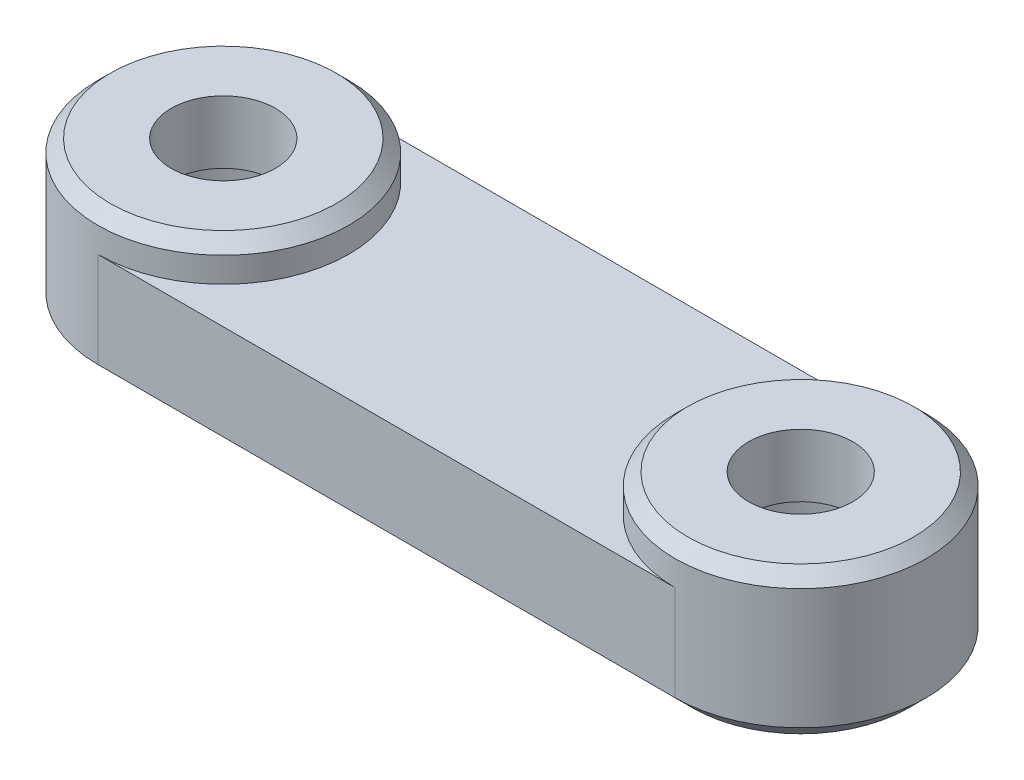
ISO-10303-21;
HEADER;
FILE_DESCRIPTION(('STEP AP214'),'2;1');
FILE_NAME('part.step','',(''),(''),'','','');
FILE_SCHEMA(('AUTOMOTIVE_DESIGN { 1 0 10303 214 1 1 1 1 }'));
ENDSEC;
DATA;
#1=APPLICATION_CONTEXT('core data for automotive mechanical design processes');
#2=APPLICATION_PROTOCOL_DEFINITION('international standard','automotive_design',2000,#1);
#3=PRODUCT_CONTEXT('',#1,'mechanical');
#4=PRODUCT('Part','Part','',(#3));
#5=PRODUCT_RELATED_PRODUCT_CATEGORY('part','',(#4));
#6=PRODUCT_DEFINITION_FORMATION('','',#4);
#7=PRODUCT_DEFINITION_CONTEXT('part definition',#1,'design');
#8=PRODUCT_DEFINITION('design','',#6,#7);
#9=PRODUCT_DEFINITION_SHAPE('','',#8);
#10=(LENGTH_UNIT() NAMED_UNIT(*) SI_UNIT(.MILLI.,.METRE.));
#11=(NAMED_UNIT(*) PLANE_ANGLE_UNIT() SI_UNIT($,.RADIAN.));
#12=(NAMED_UNIT(*) SI_UNIT($,.STERADIAN.) SOLID_ANGLE_UNIT());
#13=UNCERTAINTY_MEASURE_WITH_UNIT(LENGTH_MEASURE(1.E-05),#10,'distance_accuracy_value','');
#14=(GEOMETRIC_REPRESENTATION_CONTEXT(3) GLOBAL_UNCERTAINTY_ASSIGNED_CONTEXT((#13)) GLOBAL_UNIT_ASSIGNED_CONTEXT((#10,
#11,#12)) REPRESENTATION_CONTEXT('',''));
#15=CARTESIAN_POINT('',(0.,0.,0.));
#16=DIRECTION('',(0.,0.,1.));
#17=DIRECTION('',(1.,0.,0.));
#18=AXIS2_PLACEMENT_3D('',#15,#16,#17);
#19=CARTESIAN_POINT('',(0.,6.,0.));
#20=DIRECTION('',(0.,1.,0.));
#21=DIRECTION('',(0.,0.,1.));
#22=AXIS2_PLACEMENT_3D('',#19,#20,#21);
#23=PLANE('',#22);
#24=CARTESIAN_POINT('',(23.,6.,0.));
#25=DIRECTION('',(0.,1.,0.));
#26=DIRECTION('',(0.,0.,1.));
#27=AXIS2_PLACEMENT_3D('',#24,#25,#26);
#28=CIRCLE('',#27,4.5);
#29=CARTESIAN_POINT('',(23.,6.,4.5));
#30=VERTEX_POINT('',#29);
#31=EDGE_CURVE('E125',#30,#30,#28,.T.);
#32=ORIENTED_EDGE('',*,*,#31,.T.);
#33=EDGE_LOOP('',(#32));
#34=FACE_BOUND('',#33,.T.);
#35=CARTESIAN_POINT('',(23.,6.,0.));
#36=DIRECTION('',(0.,-1.,0.));
#37=DIRECTION('',(0.,0.,-1.));
#38=AXIS2_PLACEMENT_3D('',#35,#36,#37);
#39=CIRCLE('',#38,2.075);
#40=CARTESIAN_POINT('',(23.,6.,-2.075));
#41=VERTEX_POINT('',#40);
#42=EDGE_CURVE('E110',#41,#41,#39,.T.);
#43=ORIENTED_EDGE('',*,*,#42,.T.);
#44=EDGE_LOOP('',(#43));
#45=FACE_BOUND('',#44,.T.);
#46=ADVANCED_FACE('F41',(#34,#45),#23,.T.);
#47=CARTESIAN_POINT('',(0.,6.,0.));
#48=DIRECTION('',(0.,1.,0.));
#49=DIRECTION('',(0.,0.,1.));
#50=AXIS2_PLACEMENT_3D('',#47,#48,#49);
#51=CIRCLE('',#50,4.5);
#52=CARTESIAN_POINT('',(0.,6.,4.5));
#53=VERTEX_POINT('',#52);
#54=EDGE_CURVE('E114',#53,#53,#51,.T.);
#55=ORIENTED_EDGE('',*,*,#54,.T.);
#56=EDGE_LOOP('',(#55));
#57=FACE_BOUND('',#56,.T.);
#58=CARTESIAN_POINT('',(0.,6.,0.));
#59=DIRECTION('',(0.,-1.,0.));
#60=DIRECTION('',(0.,0.,-1.));
#61=AXIS2_PLACEMENT_3D('',#58,#59,#60);
#62=CIRCLE('',#61,2.075);
#63=CARTESIAN_POINT('',(0.,6.,-2.075));
#64=VERTEX_POINT('',#63);
#65=EDGE_CURVE('E187',#64,#64,#62,.T.);
#66=ORIENTED_EDGE('',*,*,#65,.T.);
#67=EDGE_LOOP('',(#66));
#68=FACE_BOUND('',#67,.T.);
#69=ADVANCED_FACE('F215',(#57,#68),#23,.T.);
#70=CARTESIAN_POINT('',(0.,6.,0.));
#71=DIRECTION('',(0.,-1.,0.));
#72=DIRECTION('',(0.,0.,-1.));
#73=AXIS2_PLACEMENT_3D('',#70,#71,#72);
#74=CYLINDRICAL_SURFACE('',#73,5.);
#75=CARTESIAN_POINT('',(0.,5.49999999999999,0.));
#76=DIRECTION('',(0.,1.,0.));
#77=DIRECTION('',(0.,0.,1.));
#78=AXIS2_PLACEMENT_3D('',#75,#76,#77);
#79=CIRCLE('',#78,5.);
#80=CARTESIAN_POINT('',(0.,5.49999999999999,5.));
#81=VERTEX_POINT('',#80);
#82=EDGE_CURVE('E122',#81,#81,#79,.F.);
#83=ORIENTED_EDGE('',*,*,#82,.T.);
#84=EDGE_LOOP('',(#83));
#85=FACE_BOUND('',#84,.T.);
#86=DIRECTION('',(0.,-1.,0.));
#87=VECTOR('',#86,1.);
#88=CARTESIAN_POINT('',(0.,6.,-5.));
#89=LINE('',#88,#87);
#90=CARTESIAN_POINT('',(0.,4.5,-5.00000000000926));
#91=VERTEX_POINT('',#90);
#92=CARTESIAN_POINT('',(0.,0.699999999999999,-5.));
#93=VERTEX_POINT('',#92);
#94=EDGE_CURVE('E174',#91,#93,#89,.T.);
#95=ORIENTED_EDGE('',*,*,#94,.T.);
#96=CARTESIAN_POINT('',(0.,0.699999999999999,0.));
#97=DIRECTION('',(0.,1.,0.));
#98=DIRECTION('',(0.,0.,1.));
#99=AXIS2_PLACEMENT_3D('',#96,#97,#98);
#100=CIRCLE('',#99,5.);
#101=CARTESIAN_POINT('',(0.,0.699999999999999,5.));
#102=VERTEX_POINT('',#101);
#103=EDGE_CURVE('E65',#93,#102,#100,.T.);
#104=ORIENTED_EDGE('',*,*,#103,.T.);
#105=DIRECTION('',(0.,-1.,0.));
#106=VECTOR('',#105,1.);
#107=CARTESIAN_POINT('',(0.,6.,5.));
#108=LINE('',#107,#106);
#109=CARTESIAN_POINT('',(0.,4.5,5.00000000000921));
#110=VERTEX_POINT('',#109);
#111=EDGE_CURVE('E108',#110,#102,#108,.T.);
#112=ORIENTED_EDGE('',*,*,#111,.F.);
#113=CARTESIAN_POINT('',(0.,4.5,0.));
#114=DIRECTION('',(0.,1.,0.));
#115=DIRECTION('',(0.,0.,1.));
#116=AXIS2_PLACEMENT_3D('',#113,#114,#115);
#117=CIRCLE('',#116,5.00000000000924);
#118=EDGE_CURVE('E97',#110,#91,#117,.T.);
#119=ORIENTED_EDGE('',*,*,#118,.T.);
#120=EDGE_LOOP('',(#95,#104,#112,#119));
#121=FACE_BOUND('',#120,.T.);
#122=ADVANCED_FACE('F112',(#85,#121),#74,.T.);
#123=CARTESIAN_POINT('',(0.,6.,5.));
#124=DIRECTION('',(0.,0.,-1.));
#125=DIRECTION('',(-1.,0.,0.));
#126=AXIS2_PLACEMENT_3D('',#123,#124,#125);
#127=PLANE('',#126);
#128=ORIENTED_EDGE('',*,*,#111,.T.);
#129=DIRECTION('',(1.,0.,0.));
#130=VECTOR('',#129,1.);
#131=CARTESIAN_POINT('',(0.,0.699999999999999,5.));
#132=LINE('',#131,#130);
#133=CARTESIAN_POINT('',(23.,0.699999999999999,5.));
#134=VERTEX_POINT('',#133);
#135=EDGE_CURVE('E11',#102,#134,#132,.T.);
#136=ORIENTED_EDGE('',*,*,#135,.T.);
#137=DIRECTION('',(0.,-1.,0.));
#138=VECTOR('',#137,1.);
#139=CARTESIAN_POINT('',(23.,6.,5.));
#140=LINE('',#139,#138);
#141=CARTESIAN_POINT('',(23.,4.5,4.99999999999672));
#142=VERTEX_POINT('',#141);
#143=EDGE_CURVE('E109',#142,#134,#140,.T.);
#144=ORIENTED_EDGE('',*,*,#143,.F.);
#145=DIRECTION('',(-1.,0.,0.));
#146=VECTOR('',#145,1.);
#147=CARTESIAN_POINT('',(0.,4.5,5.));
#148=LINE('',#147,#146);
#149=EDGE_CURVE('E100',#142,#110,#148,.T.);
#150=ORIENTED_EDGE('',*,*,#149,.T.);
#151=EDGE_LOOP('',(#128,#136,#144,#150));
#152=FACE_BOUND('',#151,.T.);
#153=ADVANCED_FACE('F107',(#152),#127,.F.);
#154=CARTESIAN_POINT('',(23.,6.,0.));
#155=DIRECTION('',(0.,-1.,0.));
#156=DIRECTION('',(0.,0.,-1.));
#157=AXIS2_PLACEMENT_3D('',#154,#155,#156);
#158=CYLINDRICAL_SURFACE('',#157,5.);
#159=CARTESIAN_POINT('',(23.,5.49999999999999,0.));
#160=DIRECTION('',(0.,1.,0.));
#161=DIRECTION('',(0.,0.,1.));
#162=AXIS2_PLACEMENT_3D('',#159,#160,#161);
#163=CIRCLE('',#162,5.);
#164=CARTESIAN_POINT('',(23.,5.49999999999999,5.));
#165=VERTEX_POINT('',#164);
#166=EDGE_CURVE('E128',#165,#165,#163,.F.);
#167=ORIENTED_EDGE('',*,*,#166,.T.);
#168=EDGE_LOOP('',(#167));
#169=FACE_BOUND('',#168,.T.);
#170=ORIENTED_EDGE('',*,*,#143,.T.);
#171=CARTESIAN_POINT('',(23.,0.699999999999999,0.));
#172=DIRECTION('',(0.,1.,0.));
#173=DIRECTION('',(0.,0.,1.));
#174=AXIS2_PLACEMENT_3D('',#171,#172,#173);
#175=CIRCLE('',#174,5.);
#176=CARTESIAN_POINT('',(23.,0.699999999999999,-5.));
#177=VERTEX_POINT('',#176);
#178=EDGE_CURVE('E51',#134,#177,#175,.T.);
#179=ORIENTED_EDGE('',*,*,#178,.T.);
#180=DIRECTION('',(0.,-1.,0.));
#181=VECTOR('',#180,1.);
#182=CARTESIAN_POINT('',(23.,6.,-5.));
#183=LINE('',#182,#181);
#184=CARTESIAN_POINT('',(23.,4.5,-4.99999999999672));
#185=VERTEX_POINT('',#184);
#186=EDGE_CURVE('E116',#185,#177,#183,.T.);
#187=ORIENTED_EDGE('',*,*,#186,.F.);
#188=CARTESIAN_POINT('',(23.,4.5,0.));
#189=DIRECTION('',(0.,1.,0.));
#190=DIRECTION('',(0.,0.,1.));
#191=AXIS2_PLACEMENT_3D('',#188,#189,#190);
#192=CIRCLE('',#191,4.99999999999672);
#193=EDGE_CURVE('E105',#185,#142,#192,.T.);
#194=ORIENTED_EDGE('',*,*,#193,.T.);
#195=EDGE_LOOP('',(#170,#179,#187,#194));
#196=FACE_BOUND('',#195,.T.);
#197=ADVANCED_FACE('F202',(#169,#196),#158,.T.);
#198=CARTESIAN_POINT('',(0.,6.,-5.));
#199=DIRECTION('',(0.,0.,1.));
#200=DIRECTION('',(1.,0.,0.));
#201=AXIS2_PLACEMENT_3D('',#198,#199,#200);
#202=PLANE('',#201);
#203=ORIENTED_EDGE('',*,*,#186,.T.);
#204=DIRECTION('',(-1.,0.,0.));
#205=VECTOR('',#204,1.);
#206=CARTESIAN_POINT('',(0.,0.699999999999999,-5.));
#207=LINE('',#206,#205);
#208=EDGE_CURVE('E131',#177,#93,#207,.T.);
#209=ORIENTED_EDGE('',*,*,#208,.T.);
#210=ORIENTED_EDGE('',*,*,#94,.F.);
#211=DIRECTION('',(1.,0.,0.));
#212=VECTOR('',#211,1.);
#213=CARTESIAN_POINT('',(0.,4.5,-5.));
#214=LINE('',#213,#212);
#215=EDGE_CURVE('E103',#91,#185,#214,.T.);
#216=ORIENTED_EDGE('',*,*,#215,.T.);
#217=EDGE_LOOP('',(#203,#209,#210,#216));
#218=FACE_BOUND('',#217,.T.);
#219=ADVANCED_FACE('F173',(#218),#202,.F.);
#220=CARTESIAN_POINT('',(0.,0.,0.));
#221=DIRECTION('',(0.,1.,0.));
#222=DIRECTION('',(0.,0.,1.));
#223=AXIS2_PLACEMENT_3D('',#220,#221,#222);
#224=PLANE('',#223);
#225=CARTESIAN_POINT('',(0.,0.,0.));
#226=DIRECTION('',(0.,1.,0.));
#227=DIRECTION('',(0.,0.,1.));
#228=AXIS2_PLACEMENT_3D('',#225,#226,#227);
#229=CIRCLE('',#228,4.29999999999999);
#230=CARTESIAN_POINT('',(0.,0.,4.29999999999999));
#231=VERTEX_POINT('',#230);
#232=CARTESIAN_POINT('',(0.,0.,-4.29999999999999));
#233=VERTEX_POINT('',#232);
#234=EDGE_CURVE('E138',#231,#233,#229,.F.);
#235=ORIENTED_EDGE('',*,*,#234,.T.);
#236=DIRECTION('',(1.,0.,0.));
#237=VECTOR('',#236,1.);
#238=CARTESIAN_POINT('',(0.,0.,-4.29999999999999));
#239=LINE('',#238,#237);
#240=CARTESIAN_POINT('',(23.,0.,-4.29999999999999));
#241=VERTEX_POINT('',#240);
#242=EDGE_CURVE('E140',#233,#241,#239,.T.);
#243=ORIENTED_EDGE('',*,*,#242,.T.);
#244=CARTESIAN_POINT('',(23.,0.,0.));
#245=DIRECTION('',(0.,1.,0.));
#246=DIRECTION('',(0.,0.,1.));
#247=AXIS2_PLACEMENT_3D('',#244,#245,#246);
#248=CIRCLE('',#247,4.29999999999999);
#249=CARTESIAN_POINT('',(23.,0.,4.29999999999999));
#250=VERTEX_POINT('',#249);
#251=EDGE_CURVE('E136',#241,#250,#248,.F.);
#252=ORIENTED_EDGE('',*,*,#251,.T.);
#253=DIRECTION('',(-1.,0.,0.));
#254=VECTOR('',#253,1.);
#255=CARTESIAN_POINT('',(0.,0.,4.29999999999999));
#256=LINE('',#255,#254);
#257=EDGE_CURVE('E134',#250,#231,#256,.T.);
#258=ORIENTED_EDGE('',*,*,#257,.T.);
#259=EDGE_LOOP('',(#235,#243,#252,#258));
#260=FACE_BOUND('',#259,.T.);
#261=CARTESIAN_POINT('',(23.,0.,0.));
#262=DIRECTION('',(0.,-1.,0.));
#263=DIRECTION('',(0.,0.,-1.));
#264=AXIS2_PLACEMENT_3D('',#261,#262,#263);
#265=CIRCLE('',#264,3.75);
#266=CARTESIAN_POINT('',(23.,0.,-3.75));
#267=VERTEX_POINT('',#266);
#268=EDGE_CURVE('E190',#267,#267,#265,.T.);
#269=ORIENTED_EDGE('',*,*,#268,.F.);
#270=EDGE_LOOP('',(#269));
#271=FACE_BOUND('',#270,.T.);
#272=CARTESIAN_POINT('',(0.,0.,0.));
#273=DIRECTION('',(0.,-1.,0.));
#274=DIRECTION('',(0.,0.,-1.));
#275=AXIS2_PLACEMENT_3D('',#272,#273,#274);
#276=CIRCLE('',#275,3.75);
#277=CARTESIAN_POINT('',(0.,0.,-3.75));
#278=VERTEX_POINT('',#277);
#279=EDGE_CURVE('E176',#278,#278,#276,.T.);
#280=ORIENTED_EDGE('',*,*,#279,.F.);
#281=EDGE_LOOP('',(#280));
#282=FACE_BOUND('',#281,.T.);
#283=ADVANCED_FACE('F163',(#260,#271,#282),#224,.F.);
#284=CARTESIAN_POINT('',(0.,0.,0.));
#285=DIRECTION('',(0.,-1.,0.));
#286=DIRECTION('',(0.,0.,-1.));
#287=AXIS2_PLACEMENT_3D('',#284,#285,#286);
#288=CYLINDRICAL_SURFACE('',#287,3.75);
#289=ORIENTED_EDGE('',*,*,#279,.T.);
#290=EDGE_LOOP('',(#289));
#291=FACE_BOUND('',#290,.T.);
#292=CARTESIAN_POINT('',(0.,3.5,0.));
#293=DIRECTION('',(0.,-1.,0.));
#294=DIRECTION('',(0.,0.,-1.));
#295=AXIS2_PLACEMENT_3D('',#292,#293,#294);
#296=CIRCLE('',#295,3.75);
#297=CARTESIAN_POINT('',(0.,3.5,-3.75));
#298=VERTEX_POINT('',#297);
#299=EDGE_CURVE('E179',#298,#298,#296,.T.);
#300=ORIENTED_EDGE('',*,*,#299,.F.);
#301=EDGE_LOOP('',(#300));
#302=FACE_BOUND('',#301,.T.);
#303=ADVANCED_FACE('F226',(#291,#302),#288,.F.);
#304=CARTESIAN_POINT('',(-3.75,3.5,0.));
#305=DIRECTION('',(0.,-1.,0.));
#306=DIRECTION('',(0.,0.,-1.));
#307=AXIS2_PLACEMENT_3D('',#304,#305,#306);
#308=PLANE('',#307);
#309=ORIENTED_EDGE('',*,*,#299,.T.);
#310=EDGE_LOOP('',(#309));
#311=FACE_BOUND('',#310,.T.);
#312=CARTESIAN_POINT('',(0.,3.5,0.));
#313=DIRECTION('',(0.,-1.,0.));
#314=DIRECTION('',(0.,0.,-1.));
#315=AXIS2_PLACEMENT_3D('',#312,#313,#314);
#316=CIRCLE('',#315,2.075);
#317=CARTESIAN_POINT('',(0.,3.5,-2.075));
#318=VERTEX_POINT('',#317);
#319=EDGE_CURVE('E184',#318,#318,#316,.T.);
#320=ORIENTED_EDGE('',*,*,#319,.F.);
#321=EDGE_LOOP('',(#320));
#322=FACE_BOUND('',#321,.T.);
#323=ADVANCED_FACE('F233',(#311,#322),#308,.T.);
#324=CARTESIAN_POINT('',(0.,0.,0.));
#325=DIRECTION('',(0.,-1.,0.));
#326=DIRECTION('',(0.,0.,-1.));
#327=AXIS2_PLACEMENT_3D('',#324,#325,#326);
#328=CYLINDRICAL_SURFACE('',#327,2.075);
#329=ORIENTED_EDGE('',*,*,#319,.T.);
#330=EDGE_LOOP('',(#329));
#331=FACE_BOUND('',#330,.T.);
#332=ORIENTED_EDGE('',*,*,#65,.F.);
#333=EDGE_LOOP('',(#332));
#334=FACE_BOUND('',#333,.T.);
#335=ADVANCED_FACE('F238',(#331,#334),#328,.F.);
#336=CARTESIAN_POINT('',(23.,0.,0.));
#337=DIRECTION('',(0.,-1.,0.));
#338=DIRECTION('',(0.,0.,-1.));
#339=AXIS2_PLACEMENT_3D('',#336,#337,#338);
#340=CYLINDRICAL_SURFACE('',#339,3.75);
#341=ORIENTED_EDGE('',*,*,#268,.T.);
#342=EDGE_LOOP('',(#341));
#343=FACE_BOUND('',#342,.T.);
#344=CARTESIAN_POINT('',(23.,3.5,0.));
#345=DIRECTION('',(0.,-1.,0.));
#346=DIRECTION('',(0.,0.,-1.));
#347=AXIS2_PLACEMENT_3D('',#344,#345,#346);
#348=CIRCLE('',#347,3.75);
#349=CARTESIAN_POINT('',(23.,3.5,-3.75));
#350=VERTEX_POINT('',#349);
#351=EDGE_CURVE('E193',#350,#350,#348,.T.);
#352=ORIENTED_EDGE('',*,*,#351,.F.);
#353=EDGE_LOOP('',(#352));
#354=FACE_BOUND('',#353,.T.);
#355=ADVANCED_FACE('F248',(#343,#354),#340,.F.);
#356=CARTESIAN_POINT('',(19.25,3.5,0.));
#357=DIRECTION('',(0.,-1.,0.));
#358=DIRECTION('',(0.,0.,-1.));
#359=AXIS2_PLACEMENT_3D('',#356,#357,#358);
#360=PLANE('',#359);
#361=ORIENTED_EDGE('',*,*,#351,.T.);
#362=EDGE_LOOP('',(#361));
#363=FACE_BOUND('',#362,.T.);
#364=CARTESIAN_POINT('',(23.,3.5,0.));
#365=DIRECTION('',(0.,-1.,0.));
#366=DIRECTION('',(0.,0.,-1.));
#367=AXIS2_PLACEMENT_3D('',#364,#365,#366);
#368=CIRCLE('',#367,2.075);
#369=CARTESIAN_POINT('',(23.,3.5,-2.075));
#370=VERTEX_POINT('',#369);
#371=EDGE_CURVE('E196',#370,#370,#368,.T.);
#372=ORIENTED_EDGE('',*,*,#371,.F.);
#373=EDGE_LOOP('',(#372));
#374=FACE_BOUND('',#373,.T.);
#375=ADVANCED_FACE('F255',(#363,#374),#360,.T.);
#376=CARTESIAN_POINT('',(23.,0.,0.));
#377=DIRECTION('',(0.,-1.,0.));
#378=DIRECTION('',(0.,0.,-1.));
#379=AXIS2_PLACEMENT_3D('',#376,#377,#378);
#380=CYLINDRICAL_SURFACE('',#379,2.075);
#381=ORIENTED_EDGE('',*,*,#371,.T.);
#382=EDGE_LOOP('',(#381));
#383=FACE_BOUND('',#382,.T.);
#384=ORIENTED_EDGE('',*,*,#42,.F.);
#385=EDGE_LOOP('',(#384));
#386=FACE_BOUND('',#385,.T.);
#387=ADVANCED_FACE('F261',(#383,#386),#380,.F.);
#388=CARTESIAN_POINT('',(0.,4.5,0.));
#389=DIRECTION('',(0.,-1.,0.));
#390=DIRECTION('',(0.,0.,-1.));
#391=AXIS2_PLACEMENT_3D('',#388,#389,#390);
#392=PLANE('',#391);
#393=ORIENTED_EDGE('',*,*,#193,.F.);
#394=ORIENTED_EDGE('',*,*,#215,.F.);
#395=ORIENTED_EDGE('',*,*,#118,.F.);
#396=ORIENTED_EDGE('',*,*,#149,.F.);
#397=EDGE_LOOP('',(#393,#394,#395,#396));
#398=FACE_BOUND('',#397,.T.);
#399=ADVANCED_FACE('F99',(#398),#392,.F.);
#400=CARTESIAN_POINT('',(0.,6.,0.));
#401=DIRECTION('',(0.,-1.,0.));
#402=DIRECTION('',(0.,0.,-1.));
#403=AXIS2_PLACEMENT_3D('',#400,#401,#402);
#404=CONICAL_SURFACE('',#403,4.5,0.785398163397445);
#405=ORIENTED_EDGE('',*,*,#82,.F.);
#406=EDGE_LOOP('',(#405));
#407=FACE_BOUND('',#406,.T.);
#408=ORIENTED_EDGE('',*,*,#54,.F.);
#409=EDGE_LOOP('',(#408));
#410=FACE_BOUND('',#409,.T.);
#411=ADVANCED_FACE('F266',(#407,#410),#404,.T.);
#412=CARTESIAN_POINT('',(23.,6.,0.));
#413=DIRECTION('',(0.,-1.,0.));
#414=DIRECTION('',(0.,0.,-1.));
#415=AXIS2_PLACEMENT_3D('',#412,#413,#414);
#416=CONICAL_SURFACE('',#415,4.5,0.785398163397445);
#417=ORIENTED_EDGE('',*,*,#166,.F.);
#418=EDGE_LOOP('',(#417));
#419=FACE_BOUND('',#418,.T.);
#420=ORIENTED_EDGE('',*,*,#31,.F.);
#421=EDGE_LOOP('',(#420));
#422=FACE_BOUND('',#421,.T.);
#423=ADVANCED_FACE('F269',(#419,#422),#416,.T.);
#424=CARTESIAN_POINT('',(0.,0.699999999999999,5.));
#425=DIRECTION('',(0.,0.707106781186551,-0.707106781186544));
#426=DIRECTION('',(1.,0.,0.));
#427=AXIS2_PLACEMENT_3D('',#424,#425,#426);
#428=PLANE('',#427);
#429=DIRECTION('',(0.,0.707106781186544,0.707106781186551));
#430=VECTOR('',#429,1.);
#431=CARTESIAN_POINT('',(0.,0.,4.29999999999999));
#432=LINE('',#431,#430);
#433=EDGE_CURVE('E148',#231,#102,#432,.T.);
#434=ORIENTED_EDGE('',*,*,#433,.F.);
#435=ORIENTED_EDGE('',*,*,#257,.F.);
#436=DIRECTION('',(0.,-0.707106781186544,-0.707106781186551));
#437=VECTOR('',#436,1.);
#438=CARTESIAN_POINT('',(23.,0.699999999999999,5.));
#439=LINE('',#438,#437);
#440=EDGE_CURVE('E46',#134,#250,#439,.T.);
#441=ORIENTED_EDGE('',*,*,#440,.F.);
#442=ORIENTED_EDGE('',*,*,#135,.F.);
#443=EDGE_LOOP('',(#434,#435,#441,#442));
#444=FACE_BOUND('',#443,.T.);
#445=ADVANCED_FACE('F44',(#444),#428,.F.);
#446=CARTESIAN_POINT('',(23.,0.699999999999999,0.));
#447=DIRECTION('',(0.,1.,0.));
#448=DIRECTION('',(0.,0.,1.));
#449=AXIS2_PLACEMENT_3D('',#446,#447,#448);
#450=CONICAL_SURFACE('',#449,5.,0.785398163397453);
#451=ORIENTED_EDGE('',*,*,#440,.T.);
#452=ORIENTED_EDGE('',*,*,#251,.F.);
#453=DIRECTION('',(0.,-0.707106781186544,0.707106781186551));
#454=VECTOR('',#453,1.);
#455=CARTESIAN_POINT('',(23.,0.699999999999999,-5.));
#456=LINE('',#455,#454);
#457=EDGE_CURVE('E147',#177,#241,#456,.T.);
#458=ORIENTED_EDGE('',*,*,#457,.F.);
#459=ORIENTED_EDGE('',*,*,#178,.F.);
#460=EDGE_LOOP('',(#451,#452,#458,#459));
#461=FACE_BOUND('',#460,.T.);
#462=ADVANCED_FACE('F158',(#461),#450,.T.);
#463=CARTESIAN_POINT('',(0.,0.699999999999999,0.));
#464=DIRECTION('',(0.,1.,0.));
#465=DIRECTION('',(0.,0.,1.));
#466=AXIS2_PLACEMENT_3D('',#463,#464,#465);
#467=CONICAL_SURFACE('',#466,5.,0.785398163397453);
#468=ORIENTED_EDGE('',*,*,#433,.T.);
#469=ORIENTED_EDGE('',*,*,#103,.F.);
#470=DIRECTION('',(0.,0.707106781186544,-0.707106781186551));
#471=VECTOR('',#470,1.);
#472=CARTESIAN_POINT('',(0.,0.,-4.29999999999999));
#473=LINE('',#472,#471);
#474=EDGE_CURVE('E145',#233,#93,#473,.T.);
#475=ORIENTED_EDGE('',*,*,#474,.F.);
#476=ORIENTED_EDGE('',*,*,#234,.F.);
#477=EDGE_LOOP('',(#468,#469,#475,#476));
#478=FACE_BOUND('',#477,.T.);
#479=ADVANCED_FACE('F170',(#478),#467,.T.);
#480=CARTESIAN_POINT('',(0.,0.699999999999999,-5.));
#481=DIRECTION('',(0.,0.707106781186551,0.707106781186544));
#482=DIRECTION('',(-1.,0.,0.));
#483=AXIS2_PLACEMENT_3D('',#480,#481,#482);
#484=PLANE('',#483);
#485=ORIENTED_EDGE('',*,*,#457,.T.);
#486=ORIENTED_EDGE('',*,*,#242,.F.);
#487=ORIENTED_EDGE('',*,*,#474,.T.);
#488=ORIENTED_EDGE('',*,*,#208,.F.);
#489=EDGE_LOOP('',(#485,#486,#487,#488));
#490=FACE_BOUND('',#489,.T.);
#491=ADVANCED_FACE('F168',(#490),#484,.F.);
#492=CLOSED_SHELL('',(#46,#69,#122,#153,#197,#219,#283,#303,#323,#335,#355,#375,#387,#399,#411,
#423,#445,#462,#479,#491));
#493=MANIFOLD_SOLID_BREP('B2',#492);
#494=ADVANCED_BREP_SHAPE_REPRESENTATION('',(#18,#493),#14);
#495=SHAPE_DEFINITION_REPRESENTATION(#9,#494);
ENDSEC;
END-ISO-10303-21;
